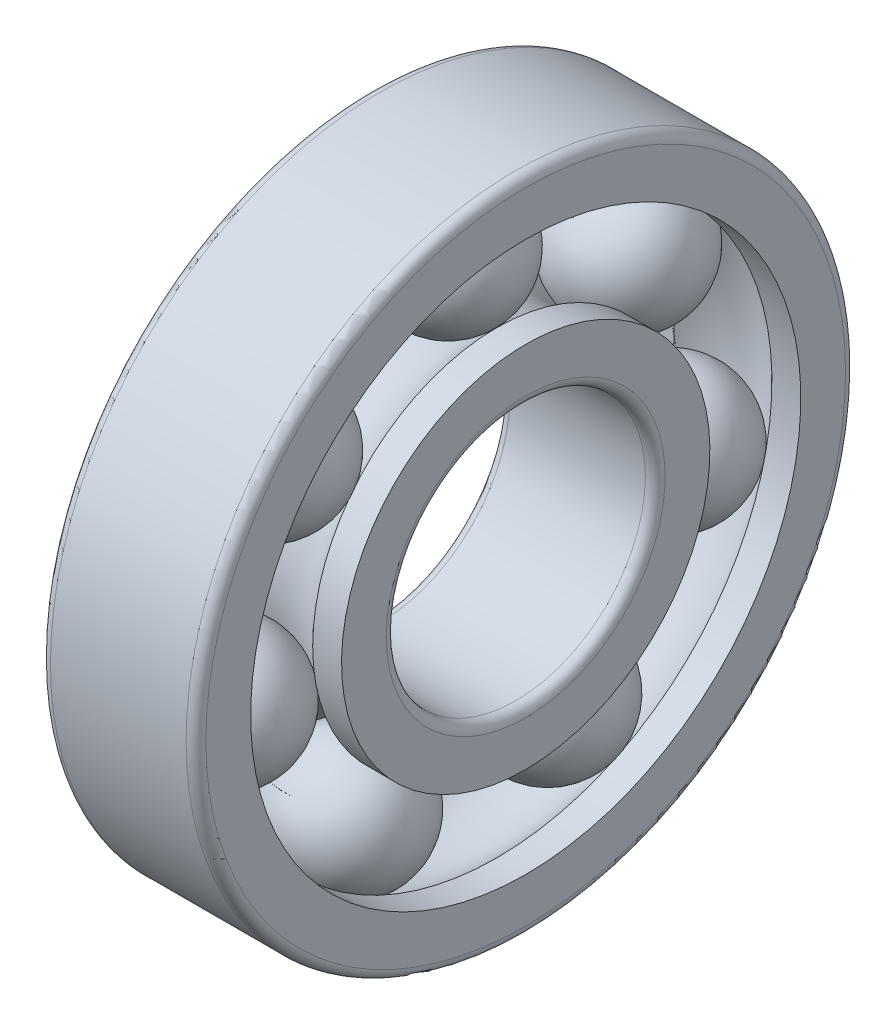
ISO-10303-21;
HEADER;
FILE_DESCRIPTION(('STEP AP214'),'2;1');
FILE_NAME('part.step','',(''),(''),'','','');
FILE_SCHEMA(('AUTOMOTIVE_DESIGN { 1 0 10303 214 1 1 1 1 }'));
ENDSEC;
DATA;
#1=APPLICATION_CONTEXT('core data for automotive mechanical design processes');
#2=APPLICATION_PROTOCOL_DEFINITION('international standard','automotive_design',2000,#1);
#3=PRODUCT_CONTEXT('',#1,'mechanical');
#4=PRODUCT('Part','Part','',(#3));
#5=PRODUCT_RELATED_PRODUCT_CATEGORY('part','',(#4));
#6=PRODUCT_DEFINITION_FORMATION('','',#4);
#7=PRODUCT_DEFINITION_CONTEXT('part definition',#1,'design');
#8=PRODUCT_DEFINITION('design','',#6,#7);
#9=PRODUCT_DEFINITION_SHAPE('','',#8);
#10=(LENGTH_UNIT() NAMED_UNIT(*) SI_UNIT(.MILLI.,.METRE.));
#11=(NAMED_UNIT(*) PLANE_ANGLE_UNIT() SI_UNIT($,.RADIAN.));
#12=(NAMED_UNIT(*) SI_UNIT($,.STERADIAN.) SOLID_ANGLE_UNIT());
#13=UNCERTAINTY_MEASURE_WITH_UNIT(LENGTH_MEASURE(1.E-05),#10,'distance_accuracy_value','');
#14=(GEOMETRIC_REPRESENTATION_CONTEXT(3) GLOBAL_UNCERTAINTY_ASSIGNED_CONTEXT((#13)) GLOBAL_UNIT_ASSIGNED_CONTEXT((#10,
#11,#12)) REPRESENTATION_CONTEXT('',''));
#15=CARTESIAN_POINT('',(0.,0.,0.));
#16=DIRECTION('',(0.,0.,1.));
#17=DIRECTION('',(1.,0.,0.));
#18=AXIS2_PLACEMENT_3D('',#15,#16,#17);
#19=CARTESIAN_POINT('',(16.5,34.35,0.));
#20=DIRECTION('',(1.,0.,0.));
#21=DIRECTION('',(0.,1.,0.));
#22=AXIS2_PLACEMENT_3D('',#19,#20,#21);
#23=PLANE('',#22);
#24=CARTESIAN_POINT('',(16.5,0.,0.));
#25=DIRECTION('',(1.,0.,0.));
#26=DIRECTION('',(0.,1.,0.));
#27=AXIS2_PLACEMENT_3D('',#24,#25,#26);
#28=CIRCLE('',#27,29.6);
#29=CARTESIAN_POINT('',(16.5,0.,29.6));
#30=VERTEX_POINT('',#29);
#31=EDGE_CURVE('P0_E111',#30,#30,#28,.T.);
#32=ORIENTED_EDGE('',*,*,#31,.F.);
#33=EDGE_LOOP('',(#32));
#34=FACE_BOUND('',#33,.T.);
#35=CARTESIAN_POINT('',(16.5,0.,0.));
#36=DIRECTION('',(1.,0.,0.));
#37=DIRECTION('',(0.,1.,0.));
#38=AXIS2_PLACEMENT_3D('',#35,#36,#37);
#39=CIRCLE('',#38,39.1);
#40=CARTESIAN_POINT('',(16.5,-39.1,0.));
#41=VERTEX_POINT('',#40);
#42=EDGE_CURVE('P0_E93',#41,#41,#39,.T.);
#43=ORIENTED_EDGE('',*,*,#42,.T.);
#44=EDGE_LOOP('',(#43));
#45=FACE_BOUND('',#44,.T.);
#46=ADVANCED_FACE('P0_F17',(#34,#45),#23,.T.);
#47=CARTESIAN_POINT('',(-16.5,34.35,0.));
#48=DIRECTION('',(-1.,0.,0.));
#49=DIRECTION('',(0.,0.,1.));
#50=AXIS2_PLACEMENT_3D('',#47,#48,#49);
#51=PLANE('',#50);
#52=CARTESIAN_POINT('',(-16.5,0.,0.));
#53=DIRECTION('',(1.,0.,0.));
#54=DIRECTION('',(0.,1.,0.));
#55=AXIS2_PLACEMENT_3D('',#52,#53,#54);
#56=CIRCLE('',#55,29.6);
#57=CARTESIAN_POINT('',(-16.5,0.,29.6));
#58=VERTEX_POINT('',#57);
#59=EDGE_CURVE('P0_E95',#58,#58,#56,.T.);
#60=ORIENTED_EDGE('',*,*,#59,.T.);
#61=EDGE_LOOP('',(#60));
#62=FACE_BOUND('',#61,.T.);
#63=CARTESIAN_POINT('',(-16.5,0.,0.));
#64=DIRECTION('',(1.,0.,0.));
#65=DIRECTION('',(0.,1.,0.));
#66=AXIS2_PLACEMENT_3D('',#63,#64,#65);
#67=CIRCLE('',#66,39.1);
#68=CARTESIAN_POINT('',(-16.5,-39.1,0.));
#69=VERTEX_POINT('',#68);
#70=EDGE_CURVE('P0_E11',#69,#69,#67,.T.);
#71=ORIENTED_EDGE('',*,*,#70,.F.);
#72=EDGE_LOOP('',(#71));
#73=FACE_BOUND('',#72,.T.);
#74=ADVANCED_FACE('P0_F155',(#62,#73),#51,.T.);
#75=CARTESIAN_POINT('',(0.,0.,0.));
#76=DIRECTION('',(1.,0.,0.));
#77=DIRECTION('',(0.,1.,0.));
#78=AXIS2_PLACEMENT_3D('',#75,#76,#77);
#79=CYLINDRICAL_SURFACE('',#78,39.1);
#80=CARTESIAN_POINT('',(-10.3716895655647,0.,0.));
#81=DIRECTION('',(-1.,0.,0.));
#82=DIRECTION('',(0.,1.,0.));
#83=AXIS2_PLACEMENT_3D('',#80,#81,#82);
#84=CIRCLE('',#83,39.1);
#85=CARTESIAN_POINT('',(-10.3716895655647,-39.1,0.));
#86=VERTEX_POINT('',#85);
#87=CARTESIAN_POINT('',(-10.3716895655647,0.,39.1));
#88=VERTEX_POINT('',#87);
#89=EDGE_CURVE('P0_E119',#86,#88,#84,.T.);
#90=ORIENTED_EDGE('',*,*,#89,.T.);
#91=CARTESIAN_POINT('',(-10.3716895655647,0.,0.));
#92=DIRECTION('',(-1.,0.,0.));
#93=DIRECTION('',(0.,1.,0.));
#94=AXIS2_PLACEMENT_3D('',#91,#92,#93);
#95=CIRCLE('',#94,39.1);
#96=EDGE_CURVE('P0_E123',#88,#86,#95,.T.);
#97=ORIENTED_EDGE('',*,*,#96,.T.);
#98=DIRECTION('',(-1.,0.,0.));
#99=VECTOR('',#98,1.);
#100=CARTESIAN_POINT('',(0.,-39.1,0.));
#101=LINE('',#100,#99);
#102=EDGE_CURVE('P0_E25',#86,#69,#101,.T.);
#103=ORIENTED_EDGE('',*,*,#102,.T.);
#104=ORIENTED_EDGE('',*,*,#70,.T.);
#105=ORIENTED_EDGE('',*,*,#102,.F.);
#106=EDGE_LOOP('',(#90,#97,#103,#104,#105));
#107=FACE_BOUND('',#106,.T.);
#108=ADVANCED_FACE('P0_F151',(#107),#79,.T.);
#109=CARTESIAN_POINT('',(-14.4,0.,0.));
#110=DIRECTION('',(1.,0.,0.));
#111=DIRECTION('',(0.,0.,-1.));
#112=AXIS2_PLACEMENT_3D('',#109,#110,#111);
#113=TOROIDAL_SURFACE('',#112,29.6,2.1);
#114=ORIENTED_EDGE('',*,*,#59,.F.);
#115=CARTESIAN_POINT('',(-14.4,0.,29.6));
#116=DIRECTION('',(0.,-1.,0.));
#117=DIRECTION('',(0.,0.,1.));
#118=AXIS2_PLACEMENT_3D('',#115,#116,#117);
#119=CIRCLE('',#118,2.1);
#120=CARTESIAN_POINT('',(-14.4,0.,27.5));
#121=VERTEX_POINT('',#120);
#122=EDGE_CURVE('P0_E44',#58,#121,#119,.T.);
#123=ORIENTED_EDGE('',*,*,#122,.T.);
#124=CARTESIAN_POINT('',(-14.4,0.,0.));
#125=DIRECTION('',(1.,0.,0.));
#126=DIRECTION('',(0.,1.,0.));
#127=AXIS2_PLACEMENT_3D('',#124,#125,#126);
#128=CIRCLE('',#127,27.5);
#129=CARTESIAN_POINT('',(-14.4,-27.5,0.));
#130=VERTEX_POINT('',#129);
#131=EDGE_CURVE('P0_E129',#121,#130,#128,.T.);
#132=ORIENTED_EDGE('',*,*,#131,.T.);
#133=CARTESIAN_POINT('',(-14.4,0.,0.));
#134=DIRECTION('',(1.,0.,0.));
#135=DIRECTION('',(0.,1.,0.));
#136=AXIS2_PLACEMENT_3D('',#133,#134,#135);
#137=CIRCLE('',#136,27.5);
#138=EDGE_CURVE('P0_E133',#130,#121,#137,.T.);
#139=ORIENTED_EDGE('',*,*,#138,.T.);
#140=ORIENTED_EDGE('',*,*,#122,.F.);
#141=EDGE_LOOP('',(#114,#123,#132,#139,#140));
#142=FACE_BOUND('',#141,.T.);
#143=ADVANCED_FACE('P0_F154',(#142),#113,.T.);
#144=CARTESIAN_POINT('',(0.,0.,0.));
#145=DIRECTION('',(1.,0.,0.));
#146=DIRECTION('',(0.,1.,0.));
#147=AXIS2_PLACEMENT_3D('',#144,#145,#146);
#148=CYLINDRICAL_SURFACE('',#147,39.1);
#149=ORIENTED_EDGE('',*,*,#42,.F.);
#150=DIRECTION('',(-1.,0.,0.));
#151=VECTOR('',#150,1.);
#152=CARTESIAN_POINT('',(0.,-39.1,0.));
#153=LINE('',#152,#151);
#154=CARTESIAN_POINT('',(10.3716895655647,-39.1,0.));
#155=VERTEX_POINT('',#154);
#156=EDGE_CURVE('P0_E87',#41,#155,#153,.T.);
#157=ORIENTED_EDGE('',*,*,#156,.T.);
#158=CARTESIAN_POINT('',(10.3716895655647,0.,0.));
#159=DIRECTION('',(1.,0.,0.));
#160=DIRECTION('',(0.,1.,0.));
#161=AXIS2_PLACEMENT_3D('',#158,#159,#160);
#162=CIRCLE('',#161,39.1);
#163=CARTESIAN_POINT('',(10.3716895655647,0.,39.1));
#164=VERTEX_POINT('',#163);
#165=EDGE_CURVE('P0_E91',#155,#164,#162,.T.);
#166=ORIENTED_EDGE('',*,*,#165,.T.);
#167=CARTESIAN_POINT('',(10.3716895655647,0.,0.));
#168=DIRECTION('',(1.,0.,0.));
#169=DIRECTION('',(0.,1.,0.));
#170=AXIS2_PLACEMENT_3D('',#167,#168,#169);
#171=CIRCLE('',#170,39.1);
#172=EDGE_CURVE('P0_E98',#164,#155,#171,.T.);
#173=ORIENTED_EDGE('',*,*,#172,.T.);
#174=ORIENTED_EDGE('',*,*,#156,.F.);
#175=EDGE_LOOP('',(#149,#157,#166,#173,#174));
#176=FACE_BOUND('',#175,.T.);
#177=ADVANCED_FACE('P0_F89',(#176),#148,.T.);
#178=CARTESIAN_POINT('',(14.4,0.,0.));
#179=DIRECTION('',(1.,0.,0.));
#180=DIRECTION('',(0.,0.,-1.));
#181=AXIS2_PLACEMENT_3D('',#178,#179,#180);
#182=TOROIDAL_SURFACE('',#181,29.6,2.1);
#183=CARTESIAN_POINT('',(14.4,0.,0.));
#184=DIRECTION('',(1.,0.,0.));
#185=DIRECTION('',(0.,1.,0.));
#186=AXIS2_PLACEMENT_3D('',#183,#184,#185);
#187=CIRCLE('',#186,27.5);
#188=CARTESIAN_POINT('',(14.4,0.,27.5));
#189=VERTEX_POINT('',#188);
#190=CARTESIAN_POINT('',(14.4,-27.5,0.));
#191=VERTEX_POINT('',#190);
#192=EDGE_CURVE('P0_E112',#189,#191,#187,.T.);
#193=ORIENTED_EDGE('',*,*,#192,.F.);
#194=CARTESIAN_POINT('',(14.4,0.,29.6));
#195=DIRECTION('',(0.,-1.,0.));
#196=DIRECTION('',(0.,0.,1.));
#197=AXIS2_PLACEMENT_3D('',#194,#195,#196);
#198=CIRCLE('',#197,2.1);
#199=EDGE_CURVE('P0_E115',#189,#30,#198,.T.);
#200=ORIENTED_EDGE('',*,*,#199,.T.);
#201=ORIENTED_EDGE('',*,*,#31,.T.);
#202=ORIENTED_EDGE('',*,*,#199,.F.);
#203=CARTESIAN_POINT('',(14.4,0.,0.));
#204=DIRECTION('',(1.,0.,0.));
#205=DIRECTION('',(0.,1.,0.));
#206=AXIS2_PLACEMENT_3D('',#203,#204,#205);
#207=CIRCLE('',#206,27.5);
#208=EDGE_CURVE('P0_E116',#191,#189,#207,.T.);
#209=ORIENTED_EDGE('',*,*,#208,.F.);
#210=EDGE_LOOP('',(#193,#200,#201,#202,#209));
#211=FACE_BOUND('',#210,.T.);
#212=ADVANCED_FACE('P0_F172',(#211),#182,.T.);
#213=CARTESIAN_POINT('',(0.,0.,0.));
#214=DIRECTION('',(1.,0.,0.));
#215=DIRECTION('',(0.,1.,0.));
#216=AXIS2_PLACEMENT_3D('',#213,#214,#215);
#217=CYLINDRICAL_SURFACE('',#216,27.5);
#218=ORIENTED_EDGE('',*,*,#131,.F.);
#219=ORIENTED_EDGE('',*,*,#138,.F.);
#220=DIRECTION('',(1.,0.,0.));
#221=VECTOR('',#220,1.);
#222=CARTESIAN_POINT('',(0.,-27.5,0.));
#223=LINE('',#222,#221);
#224=EDGE_CURVE('P0_E136',#130,#191,#223,.T.);
#225=ORIENTED_EDGE('',*,*,#224,.T.);
#226=ORIENTED_EDGE('',*,*,#208,.T.);
#227=ORIENTED_EDGE('',*,*,#192,.T.);
#228=ORIENTED_EDGE('',*,*,#224,.F.);
#229=EDGE_LOOP('',(#218,#219,#225,#226,#227,#228));
#230=FACE_BOUND('',#229,.T.);
#231=ADVANCED_FACE('P0_F177',(#230),#217,.F.);
#232=CARTESIAN_POINT('',(0.,0.,0.));
#233=DIRECTION('',(1.,0.,0.));
#234=DIRECTION('',(0.,0.,-1.));
#235=AXIS2_PLACEMENT_3D('',#232,#233,#234);
#236=TOROIDAL_SURFACE('',#235,48.75,14.1666666666667);
#237=ORIENTED_EDGE('',*,*,#165,.F.);
#238=ORIENTED_EDGE('',*,*,#172,.F.);
#239=CARTESIAN_POINT('',(0.,0.,48.75));
#240=DIRECTION('',(0.,1.,0.));
#241=DIRECTION('',(0.,0.,1.));
#242=AXIS2_PLACEMENT_3D('',#239,#240,#241);
#243=CIRCLE('',#242,14.1666666666667);
#244=EDGE_CURVE('P0_E102',#164,#88,#243,.T.);
#245=ORIENTED_EDGE('',*,*,#244,.T.);
#246=ORIENTED_EDGE('',*,*,#89,.F.);
#247=ORIENTED_EDGE('',*,*,#96,.F.);
#248=ORIENTED_EDGE('',*,*,#244,.F.);
#249=EDGE_LOOP('',(#237,#238,#245,#246,#247,#248));
#250=FACE_BOUND('',#249,.T.);
#251=ADVANCED_FACE('P0_F104',(#250),#236,.F.);
#252=CLOSED_SHELL('',(#46,#74,#108,#143,#177,#212,#231,#251));
#253=MANIFOLD_SOLID_BREP('P0_B1',#252);
#254=CARTESIAN_POINT('',(-16.5,63.15,0.));
#255=DIRECTION('',(-1.,0.,0.));
#256=DIRECTION('',(0.,0.,1.));
#257=AXIS2_PLACEMENT_3D('',#254,#255,#256);
#258=PLANE('',#257);
#259=CARTESIAN_POINT('',(-16.5,0.,0.));
#260=DIRECTION('',(1.,0.,0.));
#261=DIRECTION('',(0.,1.,0.));
#262=AXIS2_PLACEMENT_3D('',#259,#260,#261);
#263=CIRCLE('',#262,58.4);
#264=CARTESIAN_POINT('',(-16.5,-58.4,0.));
#265=VERTEX_POINT('',#264);
#266=EDGE_CURVE('P1_E103',#265,#265,#263,.T.);
#267=ORIENTED_EDGE('',*,*,#266,.T.);
#268=EDGE_LOOP('',(#267));
#269=FACE_BOUND('',#268,.T.);
#270=CARTESIAN_POINT('',(-16.5,0.,0.));
#271=DIRECTION('',(1.,0.,0.));
#272=DIRECTION('',(0.,1.,0.));
#273=AXIS2_PLACEMENT_3D('',#270,#271,#272);
#274=CIRCLE('',#273,67.9);
#275=CARTESIAN_POINT('',(-16.5,0.,67.9));
#276=VERTEX_POINT('',#275);
#277=EDGE_CURVE('P1_E143',#276,#276,#274,.T.);
#278=ORIENTED_EDGE('',*,*,#277,.F.);
#279=EDGE_LOOP('',(#278));
#280=FACE_BOUND('',#279,.T.);
#281=ADVANCED_FACE('P1_F17',(#269,#280),#258,.T.);
#282=CARTESIAN_POINT('',(16.5,63.15,0.));
#283=DIRECTION('',(1.,0.,0.));
#284=DIRECTION('',(0.,1.,0.));
#285=AXIS2_PLACEMENT_3D('',#282,#283,#284);
#286=PLANE('',#285);
#287=CARTESIAN_POINT('',(16.5,0.,0.));
#288=DIRECTION('',(1.,0.,0.));
#289=DIRECTION('',(0.,1.,0.));
#290=AXIS2_PLACEMENT_3D('',#287,#288,#289);
#291=CIRCLE('',#290,58.4);
#292=CARTESIAN_POINT('',(16.5,-58.4,0.));
#293=VERTEX_POINT('',#292);
#294=EDGE_CURVE('P1_E11',#293,#293,#291,.T.);
#295=ORIENTED_EDGE('',*,*,#294,.F.);
#296=EDGE_LOOP('',(#295));
#297=FACE_BOUND('',#296,.T.);
#298=CARTESIAN_POINT('',(16.5,0.,0.));
#299=DIRECTION('',(1.,0.,0.));
#300=DIRECTION('',(0.,1.,0.));
#301=AXIS2_PLACEMENT_3D('',#298,#299,#300);
#302=CIRCLE('',#301,67.9);
#303=CARTESIAN_POINT('',(16.5,0.,67.9));
#304=VERTEX_POINT('',#303);
#305=EDGE_CURVE('P1_E121',#304,#304,#302,.T.);
#306=ORIENTED_EDGE('',*,*,#305,.T.);
#307=EDGE_LOOP('',(#306));
#308=FACE_BOUND('',#307,.T.);
#309=ADVANCED_FACE('P1_F161',(#297,#308),#286,.T.);
#310=CARTESIAN_POINT('',(0.,0.,0.));
#311=DIRECTION('',(1.,0.,0.));
#312=DIRECTION('',(0.,1.,0.));
#313=AXIS2_PLACEMENT_3D('',#310,#311,#312);
#314=CYLINDRICAL_SURFACE('',#313,58.4);
#315=CARTESIAN_POINT('',(10.3716895655647,0.,0.));
#316=DIRECTION('',(-1.,0.,0.));
#317=DIRECTION('',(0.,1.,0.));
#318=AXIS2_PLACEMENT_3D('',#315,#316,#317);
#319=CIRCLE('',#318,58.4);
#320=CARTESIAN_POINT('',(10.3716895655647,0.,58.4));
#321=VERTEX_POINT('',#320);
#322=CARTESIAN_POINT('',(10.3716895655647,-58.4,0.));
#323=VERTEX_POINT('',#322);
#324=EDGE_CURVE('P1_E125',#321,#323,#319,.T.);
#325=ORIENTED_EDGE('',*,*,#324,.T.);
#326=DIRECTION('',(1.,0.,0.));
#327=VECTOR('',#326,1.);
#328=CARTESIAN_POINT('',(0.,-58.4,0.));
#329=LINE('',#328,#327);
#330=EDGE_CURVE('P1_E25',#323,#293,#329,.T.);
#331=ORIENTED_EDGE('',*,*,#330,.T.);
#332=ORIENTED_EDGE('',*,*,#294,.T.);
#333=ORIENTED_EDGE('',*,*,#330,.F.);
#334=CARTESIAN_POINT('',(10.3716895655647,0.,0.));
#335=DIRECTION('',(-1.,0.,0.));
#336=DIRECTION('',(0.,1.,0.));
#337=AXIS2_PLACEMENT_3D('',#334,#335,#336);
#338=CIRCLE('',#337,58.4);
#339=EDGE_CURVE('P1_E120',#323,#321,#338,.T.);
#340=ORIENTED_EDGE('',*,*,#339,.T.);
#341=EDGE_LOOP('',(#325,#331,#332,#333,#340));
#342=FACE_BOUND('',#341,.T.);
#343=ADVANCED_FACE('P1_F158',(#342),#314,.F.);
#344=CARTESIAN_POINT('',(0.,0.,0.));
#345=DIRECTION('',(1.,0.,0.));
#346=DIRECTION('',(0.,1.,0.));
#347=AXIS2_PLACEMENT_3D('',#344,#345,#346);
#348=CYLINDRICAL_SURFACE('',#347,58.4);
#349=ORIENTED_EDGE('',*,*,#266,.F.);
#350=DIRECTION('',(1.,0.,0.));
#351=VECTOR('',#350,1.);
#352=CARTESIAN_POINT('',(0.,-58.4,0.));
#353=LINE('',#352,#351);
#354=CARTESIAN_POINT('',(-10.3716895655647,-58.4,0.));
#355=VERTEX_POINT('',#354);
#356=EDGE_CURVE('P1_E47',#265,#355,#353,.T.);
#357=ORIENTED_EDGE('',*,*,#356,.T.);
#358=CARTESIAN_POINT('',(-10.3716895655647,0.,0.));
#359=DIRECTION('',(1.,0.,0.));
#360=DIRECTION('',(0.,1.,0.));
#361=AXIS2_PLACEMENT_3D('',#358,#359,#360);
#362=CIRCLE('',#361,58.4);
#363=CARTESIAN_POINT('',(-10.3716895655647,0.,58.4));
#364=VERTEX_POINT('',#363);
#365=EDGE_CURVE('P1_E102',#355,#364,#362,.T.);
#366=ORIENTED_EDGE('',*,*,#365,.T.);
#367=CARTESIAN_POINT('',(-10.3716895655647,0.,0.));
#368=DIRECTION('',(1.,0.,0.));
#369=DIRECTION('',(0.,1.,0.));
#370=AXIS2_PLACEMENT_3D('',#367,#368,#369);
#371=CIRCLE('',#370,58.4);
#372=EDGE_CURVE('P1_E107',#364,#355,#371,.T.);
#373=ORIENTED_EDGE('',*,*,#372,.T.);
#374=ORIENTED_EDGE('',*,*,#356,.F.);
#375=EDGE_LOOP('',(#349,#357,#366,#373,#374));
#376=FACE_BOUND('',#375,.T.);
#377=ADVANCED_FACE('P1_F100',(#376),#348,.F.);
#378=CARTESIAN_POINT('',(-14.4,0.,0.));
#379=DIRECTION('',(1.,0.,0.));
#380=DIRECTION('',(0.,0.,-1.));
#381=AXIS2_PLACEMENT_3D('',#378,#379,#380);
#382=TOROIDAL_SURFACE('',#381,67.9,2.1);
#383=CARTESIAN_POINT('',(-14.4,0.,0.));
#384=DIRECTION('',(1.,0.,0.));
#385=DIRECTION('',(0.,1.,0.));
#386=AXIS2_PLACEMENT_3D('',#383,#384,#385);
#387=CIRCLE('',#386,70.);
#388=CARTESIAN_POINT('',(-14.4,0.,70.));
#389=VERTEX_POINT('',#388);
#390=CARTESIAN_POINT('',(-14.4,-70.,0.));
#391=VERTEX_POINT('',#390);
#392=EDGE_CURVE('P1_E62',#389,#391,#387,.T.);
#393=ORIENTED_EDGE('',*,*,#392,.F.);
#394=CARTESIAN_POINT('',(-14.4,0.,67.9));
#395=DIRECTION('',(0.,-1.,0.));
#396=DIRECTION('',(0.,0.,1.));
#397=AXIS2_PLACEMENT_3D('',#394,#395,#396);
#398=CIRCLE('',#397,2.1);
#399=EDGE_CURVE('P1_E151',#389,#276,#398,.T.);
#400=ORIENTED_EDGE('',*,*,#399,.T.);
#401=ORIENTED_EDGE('',*,*,#277,.T.);
#402=ORIENTED_EDGE('',*,*,#399,.F.);
#403=CARTESIAN_POINT('',(-14.4,0.,0.));
#404=DIRECTION('',(1.,0.,0.));
#405=DIRECTION('',(0.,1.,0.));
#406=AXIS2_PLACEMENT_3D('',#403,#404,#405);
#407=CIRCLE('',#406,70.);
#408=EDGE_CURVE('P1_E146',#391,#389,#407,.T.);
#409=ORIENTED_EDGE('',*,*,#408,.F.);
#410=EDGE_LOOP('',(#393,#400,#401,#402,#409));
#411=FACE_BOUND('',#410,.T.);
#412=ADVANCED_FACE('P1_F167',(#411),#382,.T.);
#413=CARTESIAN_POINT('',(0.,0.,0.));
#414=DIRECTION('',(1.,0.,0.));
#415=DIRECTION('',(0.,1.,0.));
#416=AXIS2_PLACEMENT_3D('',#413,#414,#415);
#417=CYLINDRICAL_SURFACE('',#416,70.);
#418=CARTESIAN_POINT('',(14.4,0.,0.));
#419=DIRECTION('',(1.,0.,0.));
#420=DIRECTION('',(0.,1.,0.));
#421=AXIS2_PLACEMENT_3D('',#418,#419,#420);
#422=CIRCLE('',#421,70.);
#423=CARTESIAN_POINT('',(14.4,-70.,0.));
#424=VERTEX_POINT('',#423);
#425=CARTESIAN_POINT('',(14.4,0.,70.));
#426=VERTEX_POINT('',#425);
#427=EDGE_CURVE('P1_E81',#424,#426,#422,.T.);
#428=ORIENTED_EDGE('',*,*,#427,.F.);
#429=DIRECTION('',(-1.,0.,0.));
#430=VECTOR('',#429,1.);
#431=CARTESIAN_POINT('',(0.,-70.,0.));
#432=LINE('',#431,#430);
#433=EDGE_CURVE('P1_E72',#424,#391,#432,.T.);
#434=ORIENTED_EDGE('',*,*,#433,.T.);
#435=ORIENTED_EDGE('',*,*,#408,.T.);
#436=ORIENTED_EDGE('',*,*,#392,.T.);
#437=ORIENTED_EDGE('',*,*,#433,.F.);
#438=CARTESIAN_POINT('',(14.4,0.,0.));
#439=DIRECTION('',(1.,0.,0.));
#440=DIRECTION('',(0.,1.,0.));
#441=AXIS2_PLACEMENT_3D('',#438,#439,#440);
#442=CIRCLE('',#441,70.);
#443=EDGE_CURVE('P1_E136',#426,#424,#442,.T.);
#444=ORIENTED_EDGE('',*,*,#443,.F.);
#445=EDGE_LOOP('',(#428,#434,#435,#436,#437,#444));
#446=FACE_BOUND('',#445,.T.);
#447=ADVANCED_FACE('P1_F178',(#446),#417,.T.);
#448=CARTESIAN_POINT('',(14.4,0.,0.));
#449=DIRECTION('',(1.,0.,0.));
#450=DIRECTION('',(0.,0.,-1.));
#451=AXIS2_PLACEMENT_3D('',#448,#449,#450);
#452=TOROIDAL_SURFACE('',#451,67.9,2.1);
#453=ORIENTED_EDGE('',*,*,#305,.F.);
#454=CARTESIAN_POINT('',(14.4,0.,67.9));
#455=DIRECTION('',(0.,-1.,0.));
#456=DIRECTION('',(0.,0.,1.));
#457=AXIS2_PLACEMENT_3D('',#454,#455,#456);
#458=CIRCLE('',#457,2.1);
#459=EDGE_CURVE('P1_E124',#304,#426,#458,.T.);
#460=ORIENTED_EDGE('',*,*,#459,.T.);
#461=ORIENTED_EDGE('',*,*,#443,.T.);
#462=ORIENTED_EDGE('',*,*,#427,.T.);
#463=ORIENTED_EDGE('',*,*,#459,.F.);
#464=EDGE_LOOP('',(#453,#460,#461,#462,#463));
#465=FACE_BOUND('',#464,.T.);
#466=ADVANCED_FACE('P1_F180',(#465),#452,.T.);
#467=CARTESIAN_POINT('',(0.,0.,0.));
#468=DIRECTION('',(1.,0.,0.));
#469=DIRECTION('',(0.,0.,-1.));
#470=AXIS2_PLACEMENT_3D('',#467,#468,#469);
#471=TOROIDAL_SURFACE('',#470,48.75,14.1666666666667);
#472=ORIENTED_EDGE('',*,*,#365,.F.);
#473=ORIENTED_EDGE('',*,*,#372,.F.);
#474=CARTESIAN_POINT('',(0.,0.,48.75));
#475=DIRECTION('',(0.,1.,0.));
#476=DIRECTION('',(0.,0.,1.));
#477=AXIS2_PLACEMENT_3D('',#474,#475,#476);
#478=CIRCLE('',#477,14.1666666666667);
#479=EDGE_CURVE('P1_E111',#364,#321,#478,.T.);
#480=ORIENTED_EDGE('',*,*,#479,.T.);
#481=ORIENTED_EDGE('',*,*,#339,.F.);
#482=ORIENTED_EDGE('',*,*,#324,.F.);
#483=ORIENTED_EDGE('',*,*,#479,.F.);
#484=EDGE_LOOP('',(#472,#473,#480,#481,#482,#483));
#485=FACE_BOUND('',#484,.T.);
#486=ADVANCED_FACE('P1_F113',(#485),#471,.F.);
#487=CLOSED_SHELL('',(#281,#309,#343,#377,#412,#447,#466,#486));
#488=MANIFOLD_SOLID_BREP('P1_B1',#487);
#489=CARTESIAN_POINT('',(0.,30.3951278406133,-38.1142847703165));
#490=DIRECTION('',(0.,0.78183148246803,0.623489801858733));
#491=DIRECTION('',(1.,0.,0.));
#492=AXIS2_PLACEMENT_3D('',#489,#490,#491);
#493=SPHERICAL_SURFACE('',#492,14.1666666666667);
#494=CARTESIAN_POINT('',(-1.1672031145659E-09,18.1533314519022,-45.2439946848271));
#495=DIRECTION('',(-7.61193227064322E-06,-0.864127023810866,-0.503273769097728));
#496=DIRECTION('',(3.67378590372629E-05,0.503273768531032,-0.864127023393496));
#497=AXIS2_PLACEMENT_3D('',#494,#495,#496);
#498=ELLIPSE('',#497,0.0101072605263137,0.0100000011673483);
#499=CARTESIAN_POINT('',(0.,18.1482447328018,-45.2352607278695));
#500=VERTEX_POINT('',#499);
#501=EDGE_CURVE('P2_E191',#500,#500,#498,.T.);
#502=ORIENTED_EDGE('',*,*,#501,.F.);
#503=EDGE_LOOP('',(#502));
#504=FACE_BOUND('',#503,.T.);
#505=CARTESIAN_POINT('',(1.1671805053864E-09,40.0701370077481,-27.76592548473));
#506=DIRECTION('',(7.61193981967191E-06,0.682941997358716,0.730472606047445));
#507=DIRECTION('',(3.67377042685629E-05,-0.730472605766644,0.682941996713359));
#508=AXIS2_PLACEMENT_3D('',#505,#506,#507);
#509=ELLIPSE('',#508,0.0101072605263092,0.0100000011673212);
#510=CARTESIAN_POINT('',(0.,40.0627539308114,-27.7590228120382));
#511=VERTEX_POINT('',#510);
#512=EDGE_CURVE('P2_E213',#511,#511,#509,.T.);
#513=ORIENTED_EDGE('',*,*,#512,.F.);
#514=EDGE_LOOP('',(#513));
#515=FACE_BOUND('',#514,.T.);
#516=CARTESIAN_POINT('',(0.,30.3951278406133,-38.1142847703165));
#517=DIRECTION('',(0.,-0.623489801858733,0.78183148246803));
#518=DIRECTION('',(-1.,0.,0.));
#519=AXIS2_PLACEMENT_3D('',#516,#517,#518);
#520=CIRCLE('',#519,14.1666666666667);
#521=CARTESIAN_POINT('',(0.,41.4710738422438,-29.2815125773178));
#522=VERTEX_POINT('',#521);
#523=CARTESIAN_POINT('',(0.,19.3191818389828,-46.9470569633152));
#524=VERTEX_POINT('',#523);
#525=EDGE_CURVE('P2_E11',#522,#524,#520,.T.);
#526=ORIENTED_EDGE('',*,*,#525,.T.);
#527=ORIENTED_EDGE('',*,*,#525,.F.);
#528=EDGE_LOOP('',(#526,#527));
#529=FACE_BOUND('',#528,.T.);
#530=ADVANCED_FACE('P2_F17',(#504,#515,#529),#493,.T.);
#531=CARTESIAN_POINT('',(0.,-10.8478955303703,-47.5277357188639));
#532=DIRECTION('',(0.,0.974927912181824,-0.222520933956315));
#533=DIRECTION('',(1.,0.,0.));
#534=AXIS2_PLACEMENT_3D('',#531,#532,#533);
#535=SPHERICAL_SURFACE('',#534,14.1666666666667);
#536=CARTESIAN_POINT('',(-1.16722697899807E-09,-24.0547624071915,-42.4020153221147));
#537=DIRECTION('',(-7.61194746226723E-06,-0.932249663837589,0.361815649491229));
#538=DIRECTION('',(3.67378270325305E-05,-0.361815649518246,-0.932249663134303));
#539=AXIS2_PLACEMENT_3D('',#536,#537,#538);
#540=ELLIPSE('',#539,0.0101072605263181,0.010000001167372);
#541=CARTESIAN_POINT('',(0.,-24.0511054421596,-42.3925928318866));
#542=VERTEX_POINT('',#541);
#543=EDGE_CURVE('P2_E180',#542,#542,#540,.T.);
#544=ORIENTED_EDGE('',*,*,#543,.F.);
#545=EDGE_LOOP('',(#544));
#546=FACE_BOUND('',#545,.T.);
#547=CARTESIAN_POINT('',(1.16718686065869E-09,3.27504709958993,-48.6398659983634));
#548=DIRECTION('',(7.61193966755833E-06,0.996913851102729,-0.0785033338246527));
#549=DIRECTION('',(3.67378276275639E-05,0.0785033334951672,0.996913850480812));
#550=AXIS2_PLACEMENT_3D('',#547,#548,#549);
#551=ELLIPSE('',#550,0.0101072605263137,0.0100000011673263);
#552=CARTESIAN_POINT('',(0.,3.2758405532371,-48.6297899303479));
#553=VERTEX_POINT('',#552);
#554=EDGE_CURVE('P2_E203',#553,#553,#551,.T.);
#555=ORIENTED_EDGE('',*,*,#554,.F.);
#556=EDGE_LOOP('',(#555));
#557=FACE_BOUND('',#556,.T.);
#558=CARTESIAN_POINT('',(0.,-10.8478955303703,-47.5277357188639));
#559=DIRECTION('',(0.,0.222520933956315,0.974927912181823));
#560=DIRECTION('',(-1.,0.,0.));
#561=AXIS2_PLACEMENT_3D('',#558,#559,#560);
#562=CIRCLE('',#561,14.1666666666667);
#563=CARTESIAN_POINT('',(0.,2.9635832255389,-50.6801156165784));
#564=VERTEX_POINT('',#563);
#565=CARTESIAN_POINT('',(0.,-24.6593742862795,-44.3753558211494));
#566=VERTEX_POINT('',#565);
#567=EDGE_CURVE('P2_E25',#564,#566,#562,.T.);
#568=ORIENTED_EDGE('',*,*,#567,.T.);
#569=ORIENTED_EDGE('',*,*,#567,.F.);
#570=EDGE_LOOP('',(#568,#569));
#571=FACE_BOUND('',#570,.T.);
#572=ADVANCED_FACE('P2_F240',(#546,#557,#571),#535,.T.);
#573=CARTESIAN_POINT('',(0.,-43.9222323102429,-21.151832281981));
#574=DIRECTION('',(0.,0.433883739117558,-0.900968867902419));
#575=DIRECTION('',(1.,0.,0.));
#576=AXIS2_PLACEMENT_3D('',#573,#574,#575);
#577=SPHERICAL_SURFACE('',#576,14.1666666666667);
#578=CARTESIAN_POINT('',(-1.16719975990322E-09,-48.1491295459398,-7.63045357836544));
#579=DIRECTION('',(-7.61193736899551E-06,-0.298369292566209,0.954450504319422));
#580=DIRECTION('',(3.67378435249862E-05,-0.954450503786415,-0.298369292106594));
#581=AXIS2_PLACEMENT_3D('',#578,#579,#580);
#582=ELLIPSE('',#581,0.0101072605263181,0.0100000011673427);
#583=CARTESIAN_POINT('',(0.,-48.1394826660331,-7.62743788219238));
#584=VERTEX_POINT('',#583);
#585=EDGE_CURVE('P2_E175',#584,#584,#582,.T.);
#586=ORIENTED_EDGE('',*,*,#585,.F.);
#587=EDGE_LOOP('',(#586));
#588=FACE_BOUND('',#587,.T.);
#589=CARTESIAN_POINT('',(1.16719538045364E-09,-35.9862200733455,-32.88699534278));
#590=DIRECTION('',(7.61193954932608E-06,0.560189241633878,-0.828364662150504));
#591=DIRECTION('',(3.6737775027297E-05,0.828364661458841,0.560189241503722));
#592=AXIS2_PLACEMENT_3D('',#589,#590,#591);
#593=ELLIPSE('',#592,0.0101072605263092,0.0100000011673358);
#594=CARTESIAN_POINT('',(0.,-35.9778475758942,-32.8813333641707));
#595=VERTEX_POINT('',#594);
#596=EDGE_CURVE('P2_E188',#595,#595,#593,.T.);
#597=ORIENTED_EDGE('',*,*,#596,.F.);
#598=EDGE_LOOP('',(#597));
#599=FACE_BOUND('',#598,.T.);
#600=CARTESIAN_POINT('',(0.,-43.9222323102429,-21.151832281981));
#601=DIRECTION('',(0.,0.900968867902419,0.433883739117558));
#602=DIRECTION('',(-1.,0.,0.));
#603=AXIS2_PLACEMENT_3D('',#600,#601,#602);
#604=CIRCLE('',#603,14.1666666666667);
#605=CARTESIAN_POINT('',(0.,-37.7755460060775,-33.9155579105986));
#606=VERTEX_POINT('',#605);
#607=CARTESIAN_POINT('',(0.,-50.0689186144083,-8.38810665336337));
#608=VERTEX_POINT('',#607);
#609=EDGE_CURVE('P2_E195',#606,#608,#604,.T.);
#610=ORIENTED_EDGE('',*,*,#609,.T.);
#611=ORIENTED_EDGE('',*,*,#609,.F.);
#612=EDGE_LOOP('',(#610,#611));
#613=FACE_BOUND('',#612,.T.);
#614=ADVANCED_FACE('P2_F242',(#588,#599,#613),#577,.T.);
#615=CARTESIAN_POINT('',(0.,-43.9222323102429,21.151832281981));
#616=DIRECTION('',(0.,-0.433883739117558,-0.900968867902419));
#617=DIRECTION('',(1.,0.,0.));
#618=AXIS2_PLACEMENT_3D('',#615,#616,#617);
#619=SPHERICAL_SURFACE('',#618,14.1666666666667);
#620=CARTESIAN_POINT('',(-1.16719543339797E-09,-35.9862200733455,32.88699534278));
#621=DIRECTION('',(-7.61193967894247E-06,0.560189241634383,0.828364662150163));
#622=DIRECTION('',(3.67378285813534E-05,-0.828364661458498,0.560189241504227));
#623=AXIS2_PLACEMENT_3D('',#620,#621,#622);
#624=ELLIPSE('',#623,0.0101072605263092,0.0100000011673359);
#625=CARTESIAN_POINT('',(0.,-35.9778475758942,32.8813333641707));
#626=VERTEX_POINT('',#625);
#627=EDGE_CURVE('P2_E155',#626,#626,#624,.T.);
#628=ORIENTED_EDGE('',*,*,#627,.F.);
#629=EDGE_LOOP('',(#628));
#630=FACE_BOUND('',#629,.T.);
#631=CARTESIAN_POINT('',(1.16716224798096E-09,-48.1491295459398,7.63045357836545));
#632=DIRECTION('',(7.61193636231381E-06,-0.298369292566258,-0.954450504319406));
#633=DIRECTION('',(3.67377738143665E-05,0.954450503786402,-0.298369292106645));
#634=AXIS2_PLACEMENT_3D('',#631,#632,#633);
#635=ELLIPSE('',#634,0.0101072605263137,0.0100000011673052);
#636=CARTESIAN_POINT('',(0.,-48.1394826660331,7.62743788219239));
#637=VERTEX_POINT('',#636);
#638=EDGE_CURVE('P2_E174',#637,#637,#635,.T.);
#639=ORIENTED_EDGE('',*,*,#638,.F.);
#640=EDGE_LOOP('',(#639));
#641=FACE_BOUND('',#640,.T.);
#642=CARTESIAN_POINT('',(0.,-43.9222323102429,21.151832281981));
#643=DIRECTION('',(0.,0.900968867902419,-0.433883739117558));
#644=DIRECTION('',(-1.,0.,0.));
#645=AXIS2_PLACEMENT_3D('',#642,#643,#644);
#646=CIRCLE('',#645,14.1666666666667);
#647=CARTESIAN_POINT('',(0.,-50.0689186144083,8.38810665336337));
#648=VERTEX_POINT('',#647);
#649=CARTESIAN_POINT('',(0.,-37.7755460060775,33.9155579105986));
#650=VERTEX_POINT('',#649);
#651=EDGE_CURVE('P2_E198',#648,#650,#646,.T.);
#652=ORIENTED_EDGE('',*,*,#651,.T.);
#653=ORIENTED_EDGE('',*,*,#651,.F.);
#654=EDGE_LOOP('',(#652,#653));
#655=FACE_BOUND('',#654,.T.);
#656=ADVANCED_FACE('P2_F249',(#630,#641,#655),#619,.T.);
#657=CARTESIAN_POINT('',(0.,-10.8478955303703,47.5277357188639));
#658=DIRECTION('',(0.,-0.974927912181824,-0.222520933956314));
#659=DIRECTION('',(1.,0.,0.));
#660=AXIS2_PLACEMENT_3D('',#657,#658,#659);
#661=SPHERICAL_SURFACE('',#660,14.1666666666667);
#662=CARTESIAN_POINT('',(-1.16719678684702E-09,3.27504709958996,48.6398659983634));
#663=DIRECTION('',(-7.61193515128707E-06,0.996913851102763,0.0785033338242232));
#664=DIRECTION('',(3.6737870128725E-05,-0.0785033334947374,0.996913850480844));
#665=AXIS2_PLACEMENT_3D('',#662,#663,#664);
#666=ELLIPSE('',#665,0.0101072605263092,0.0100000011673362);
#667=CARTESIAN_POINT('',(0.,3.27584055323712,48.6297899303479));
#668=VERTEX_POINT('',#667);
#669=EDGE_CURVE('P2_E216',#668,#668,#666,.T.);
#670=ORIENTED_EDGE('',*,*,#669,.F.);
#671=EDGE_LOOP('',(#670));
#672=FACE_BOUND('',#671,.T.);
#673=CARTESIAN_POINT('',(1.16720514883243E-09,-24.0547624071915,42.4020153221147));
#674=DIRECTION('',(7.61194341494051E-06,-0.932249663837886,-0.361815649490465));
#675=DIRECTION('',(3.67378019952505E-05,0.361815649517482,-0.932249663134601));
#676=AXIS2_PLACEMENT_3D('',#673,#674,#675);
#677=ELLIPSE('',#676,0.0101072605263181,0.0100000011673502);
#678=CARTESIAN_POINT('',(0.,-24.0511054421596,42.3925928318866));
#679=VERTEX_POINT('',#678);
#680=EDGE_CURVE('P2_E169',#679,#679,#677,.T.);
#681=ORIENTED_EDGE('',*,*,#680,.F.);
#682=EDGE_LOOP('',(#681));
#683=FACE_BOUND('',#682,.T.);
#684=CARTESIAN_POINT('',(0.,-10.8478955303703,47.5277357188639));
#685=DIRECTION('',(0.,0.222520933956314,-0.974927912181824));
#686=DIRECTION('',(-1.,0.,0.));
#687=AXIS2_PLACEMENT_3D('',#684,#685,#686);
#688=CIRCLE('',#687,14.1666666666667);
#689=CARTESIAN_POINT('',(0.,-24.6593742862795,44.3753558211495));
#690=VERTEX_POINT('',#689);
#691=CARTESIAN_POINT('',(0.,2.9635832255389,50.6801156165783));
#692=VERTEX_POINT('',#691);
#693=EDGE_CURVE('P2_E233',#690,#692,#688,.T.);
#694=ORIENTED_EDGE('',*,*,#693,.T.);
#695=ORIENTED_EDGE('',*,*,#693,.F.);
#696=EDGE_LOOP('',(#694,#695));
#697=FACE_BOUND('',#696,.T.);
#698=ADVANCED_FACE('P2_F256',(#672,#683,#697),#661,.T.);
#699=CARTESIAN_POINT('',(0.,30.3951278406133,38.1142847703164));
#700=DIRECTION('',(0.,-0.78183148246803,0.623489801858734));
#701=DIRECTION('',(1.,0.,0.));
#702=AXIS2_PLACEMENT_3D('',#699,#700,#701);
#703=SPHERICAL_SURFACE('',#702,14.1666666666667);
#704=CARTESIAN_POINT('',(-1.16717034100633E-09,40.0701370077482,27.7659254847299));
#705=DIRECTION('',(-7.6119349182107E-06,0.682941997356785,-0.730472606049251));
#706=DIRECTION('',(3.67378022467793E-05,0.730472605768448,0.682941996711425));
#707=AXIS2_PLACEMENT_3D('',#704,#705,#706);
#708=ELLIPSE('',#707,0.0101072605263092,0.0100000011673111);
#709=CARTESIAN_POINT('',(0.,40.0627539308114,27.7590228120382));
#710=VERTEX_POINT('',#709);
#711=EDGE_CURVE('P2_E147',#710,#710,#708,.T.);
#712=ORIENTED_EDGE('',*,*,#711,.F.);
#713=EDGE_LOOP('',(#712));
#714=FACE_BOUND('',#713,.T.);
#715=CARTESIAN_POINT('',(1.16717847335501E-09,18.1533314519023,45.2439946848271));
#716=DIRECTION('',(7.61193997086388E-06,-0.864127023810373,0.503273769098575));
#717=DIRECTION('',(3.67378017299682E-05,-0.50327376853188,-0.864127023393004));
#718=AXIS2_PLACEMENT_3D('',#715,#716,#717);
#719=ELLIPSE('',#718,0.0101072605263137,0.0100000011673237);
#720=CARTESIAN_POINT('',(0.,18.1482447328019,45.2352607278695));
#721=VERTEX_POINT('',#720);
#722=EDGE_CURVE('P2_E224',#721,#721,#719,.T.);
#723=ORIENTED_EDGE('',*,*,#722,.F.);
#724=EDGE_LOOP('',(#723));
#725=FACE_BOUND('',#724,.T.);
#726=CARTESIAN_POINT('',(0.,30.3951278406133,38.1142847703164));
#727=DIRECTION('',(0.,-0.623489801858734,-0.78183148246803));
#728=DIRECTION('',(-1.,0.,0.));
#729=AXIS2_PLACEMENT_3D('',#726,#727,#728);
#730=CIRCLE('',#729,14.1666666666667);
#731=CARTESIAN_POINT('',(0.,19.3191818389829,46.9470569633151));
#732=VERTEX_POINT('',#731);
#733=CARTESIAN_POINT('',(0.,41.4710738422437,29.2815125773177));
#734=VERTEX_POINT('',#733);
#735=EDGE_CURVE('P2_E230',#732,#734,#730,.T.);
#736=ORIENTED_EDGE('',*,*,#735,.T.);
#737=ORIENTED_EDGE('',*,*,#735,.F.);
#738=EDGE_LOOP('',(#736,#737));
#739=FACE_BOUND('',#738,.T.);
#740=ADVANCED_FACE('P2_F258',(#714,#725,#739),#703,.T.);
#741=CARTESIAN_POINT('',(0.,48.75,0.));
#742=DIRECTION('',(0.,0.,1.));
#743=DIRECTION('',(1.,0.,0.));
#744=AXIS2_PLACEMENT_3D('',#741,#742,#743);
#745=SPHERICAL_SURFACE('',#744,14.1666666666667);
#746=CARTESIAN_POINT('',(-1.16716512343296E-09,46.6915964672365,-14.0163232405662));
#747=DIRECTION('',(-7.61193890945707E-06,-0.145299109877815,-0.989387774641861));
#748=DIRECTION('',(3.67377900865996E-05,0.98938777396222,-0.14529911006065));
#749=AXIS2_PLACEMENT_3D('',#746,#747,#748);
#750=ELLIPSE('',#749,0.0101072605263048,0.0100000011673084);
#751=CARTESIAN_POINT('',(0.,46.6815964672365,-14.0148546646084));
#752=VERTEX_POINT('',#751);
#753=EDGE_CURVE('P2_E160',#752,#752,#750,.T.);
#754=ORIENTED_EDGE('',*,*,#753,.F.);
#755=EDGE_LOOP('',(#754));
#756=FACE_BOUND('',#755,.T.);
#757=CARTESIAN_POINT('',(1.16717128240983E-09,46.6915964672365,14.0163232405662));
#758=DIRECTION('',(7.61194068616627E-06,-0.145299109878568,0.98938777464175));
#759=DIRECTION('',(3.67378191370836E-05,-0.989387773962109,-0.145299110061403));
#760=AXIS2_PLACEMENT_3D('',#757,#758,#759);
#761=ELLIPSE('',#760,0.0101072605263137,0.0100000011673146);
#762=CARTESIAN_POINT('',(0.,46.6815964672365,14.0148546646084));
#763=VERTEX_POINT('',#762);
#764=EDGE_CURVE('P2_E149',#763,#763,#761,.T.);
#765=ORIENTED_EDGE('',*,*,#764,.F.);
#766=EDGE_LOOP('',(#765));
#767=FACE_BOUND('',#766,.T.);
#768=CARTESIAN_POINT('',(0.,48.75,0.));
#769=DIRECTION('',(0.,-1.,0.));
#770=DIRECTION('',(-1.,0.,0.));
#771=AXIS2_PLACEMENT_3D('',#768,#769,#770);
#772=CIRCLE('',#771,14.1666666666667);
#773=CARTESIAN_POINT('',(0.,48.75,14.1666666666667));
#774=VERTEX_POINT('',#773);
#775=CARTESIAN_POINT('',(0.,48.75,-14.1666666666667));
#776=VERTEX_POINT('',#775);
#777=EDGE_CURVE('P2_E227',#774,#776,#772,.T.);
#778=ORIENTED_EDGE('',*,*,#777,.T.);
#779=ORIENTED_EDGE('',*,*,#777,.F.);
#780=EDGE_LOOP('',(#778,#779));
#781=FACE_BOUND('',#780,.T.);
#782=ADVANCED_FACE('P2_F263',(#756,#767,#781),#745,.T.);
#783=CARTESIAN_POINT('',(0.,0.,0.));
#784=DIRECTION('',(1.,0.,0.));
#785=DIRECTION('',(0.,0.,-1.));
#786=AXIS2_PLACEMENT_3D('',#783,#784,#785);
#787=TOROIDAL_SURFACE('',#786,48.75,0.01);
#788=ORIENTED_EDGE('',*,*,#669,.T.);
#789=CARTESIAN_POINT('',(0.,0.,0.));
#790=DIRECTION('',(-1.,0.,0.));
#791=DIRECTION('',(0.,0.,-1.));
#792=AXIS2_PLACEMENT_3D('',#789,#790,#791);
#793=CIRCLE('',#792,48.74);
#794=EDGE_CURVE('P2_E220',#668,#721,#793,.T.);
#795=ORIENTED_EDGE('',*,*,#794,.T.);
#796=ORIENTED_EDGE('',*,*,#722,.T.);
#797=ORIENTED_EDGE('',*,*,#794,.F.);
#798=EDGE_LOOP('',(#788,#795,#796,#797));
#799=FACE_BOUND('',#798,.T.);
#800=ADVANCED_FACE('P2_F267',(#799),#787,.T.);
#801=CARTESIAN_POINT('',(0.,0.,0.));
#802=DIRECTION('',(1.,0.,0.));
#803=DIRECTION('',(0.,0.,-1.));
#804=AXIS2_PLACEMENT_3D('',#801,#802,#803);
#805=TOROIDAL_SURFACE('',#804,48.75,0.01);
#806=ORIENTED_EDGE('',*,*,#753,.T.);
#807=CARTESIAN_POINT('',(0.,0.,0.));
#808=DIRECTION('',(-1.,0.,0.));
#809=DIRECTION('',(0.,0.,-1.));
#810=AXIS2_PLACEMENT_3D('',#807,#808,#809);
#811=CIRCLE('',#810,48.74);
#812=EDGE_CURVE('P2_E209',#752,#511,#811,.T.);
#813=ORIENTED_EDGE('',*,*,#812,.T.);
#814=ORIENTED_EDGE('',*,*,#512,.T.);
#815=ORIENTED_EDGE('',*,*,#812,.F.);
#816=EDGE_LOOP('',(#806,#813,#814,#815));
#817=FACE_BOUND('',#816,.T.);
#818=ADVANCED_FACE('P2_F271',(#817),#805,.T.);
#819=CARTESIAN_POINT('',(0.,0.,0.));
#820=DIRECTION('',(1.,0.,0.));
#821=DIRECTION('',(0.,0.,-1.));
#822=AXIS2_PLACEMENT_3D('',#819,#820,#821);
#823=TOROIDAL_SURFACE('',#822,48.75,0.01);
#824=ORIENTED_EDGE('',*,*,#501,.T.);
#825=CARTESIAN_POINT('',(0.,0.,0.));
#826=DIRECTION('',(-1.,0.,0.));
#827=DIRECTION('',(0.,0.,-1.));
#828=AXIS2_PLACEMENT_3D('',#825,#826,#827);
#829=CIRCLE('',#828,48.74);
#830=EDGE_CURVE('P2_E199',#500,#553,#829,.T.);
#831=ORIENTED_EDGE('',*,*,#830,.T.);
#832=ORIENTED_EDGE('',*,*,#554,.T.);
#833=ORIENTED_EDGE('',*,*,#830,.F.);
#834=EDGE_LOOP('',(#824,#831,#832,#833));
#835=FACE_BOUND('',#834,.T.);
#836=ADVANCED_FACE('P2_F273',(#835),#823,.T.);
#837=CARTESIAN_POINT('',(0.,0.,0.));
#838=DIRECTION('',(1.,0.,0.));
#839=DIRECTION('',(0.,0.,-1.));
#840=AXIS2_PLACEMENT_3D('',#837,#838,#839);
#841=TOROIDAL_SURFACE('',#840,48.75,0.01);
#842=ORIENTED_EDGE('',*,*,#543,.T.);
#843=CARTESIAN_POINT('',(0.,0.,0.));
#844=DIRECTION('',(-1.,0.,0.));
#845=DIRECTION('',(0.,0.,-1.));
#846=AXIS2_PLACEMENT_3D('',#843,#844,#845);
#847=CIRCLE('',#846,48.74);
#848=EDGE_CURVE('P2_E187',#542,#595,#847,.T.);
#849=ORIENTED_EDGE('',*,*,#848,.T.);
#850=ORIENTED_EDGE('',*,*,#596,.T.);
#851=ORIENTED_EDGE('',*,*,#848,.F.);
#852=EDGE_LOOP('',(#842,#849,#850,#851));
#853=FACE_BOUND('',#852,.T.);
#854=ADVANCED_FACE('P2_F276',(#853),#841,.T.);
#855=CARTESIAN_POINT('',(0.,0.,0.));
#856=DIRECTION('',(1.,0.,0.));
#857=DIRECTION('',(0.,0.,-1.));
#858=AXIS2_PLACEMENT_3D('',#855,#856,#857);
#859=TOROIDAL_SURFACE('',#858,48.75,0.01);
#860=ORIENTED_EDGE('',*,*,#585,.T.);
#861=CARTESIAN_POINT('',(0.,0.,0.));
#862=DIRECTION('',(-1.,0.,0.));
#863=DIRECTION('',(0.,0.,-1.));
#864=AXIS2_PLACEMENT_3D('',#861,#862,#863);
#865=CIRCLE('',#864,48.74);
#866=EDGE_CURVE('P2_E170',#584,#637,#865,.T.);
#867=ORIENTED_EDGE('',*,*,#866,.T.);
#868=ORIENTED_EDGE('',*,*,#638,.T.);
#869=ORIENTED_EDGE('',*,*,#866,.F.);
#870=EDGE_LOOP('',(#860,#867,#868,#869));
#871=FACE_BOUND('',#870,.T.);
#872=ADVANCED_FACE('P2_F280',(#871),#859,.T.);
#873=CARTESIAN_POINT('',(0.,0.,0.));
#874=DIRECTION('',(1.,0.,0.));
#875=DIRECTION('',(0.,0.,-1.));
#876=AXIS2_PLACEMENT_3D('',#873,#874,#875);
#877=TOROIDAL_SURFACE('',#876,48.75,0.01);
#878=ORIENTED_EDGE('',*,*,#627,.T.);
#879=CARTESIAN_POINT('',(0.,0.,0.));
#880=DIRECTION('',(-1.,0.,0.));
#881=DIRECTION('',(0.,0.,-1.));
#882=AXIS2_PLACEMENT_3D('',#879,#880,#881);
#883=CIRCLE('',#882,48.74);
#884=EDGE_CURVE('P2_E165',#626,#679,#883,.T.);
#885=ORIENTED_EDGE('',*,*,#884,.T.);
#886=ORIENTED_EDGE('',*,*,#680,.T.);
#887=ORIENTED_EDGE('',*,*,#884,.F.);
#888=EDGE_LOOP('',(#878,#885,#886,#887));
#889=FACE_BOUND('',#888,.T.);
#890=ADVANCED_FACE('P2_F287',(#889),#877,.T.);
#891=CARTESIAN_POINT('',(0.,0.,0.));
#892=DIRECTION('',(1.,0.,0.));
#893=DIRECTION('',(0.,0.,-1.));
#894=AXIS2_PLACEMENT_3D('',#891,#892,#893);
#895=TOROIDAL_SURFACE('',#894,48.75,0.01);
#896=ORIENTED_EDGE('',*,*,#711,.T.);
#897=CARTESIAN_POINT('',(0.,0.,0.));
#898=DIRECTION('',(-1.,0.,0.));
#899=DIRECTION('',(0.,0.,-1.));
#900=AXIS2_PLACEMENT_3D('',#897,#898,#899);
#901=CIRCLE('',#900,48.74);
#902=EDGE_CURVE('P2_E144',#710,#763,#901,.T.);
#903=ORIENTED_EDGE('',*,*,#902,.T.);
#904=ORIENTED_EDGE('',*,*,#764,.T.);
#905=ORIENTED_EDGE('',*,*,#902,.F.);
#906=EDGE_LOOP('',(#896,#903,#904,#905));
#907=FACE_BOUND('',#906,.T.);
#908=ADVANCED_FACE('P2_F145',(#907),#895,.T.);
#909=CLOSED_SHELL('',(#530,#572,#614,#656,#698,#740,#782,#800,#818,#836,#854,#872,#890,#908));
#910=MANIFOLD_SOLID_BREP('P2_B1',#909);
#911=ADVANCED_BREP_SHAPE_REPRESENTATION('',(#18,#253,#488,#910),#14);
#912=SHAPE_DEFINITION_REPRESENTATION(#9,#911);
ENDSEC;
END-ISO-10303-21;
